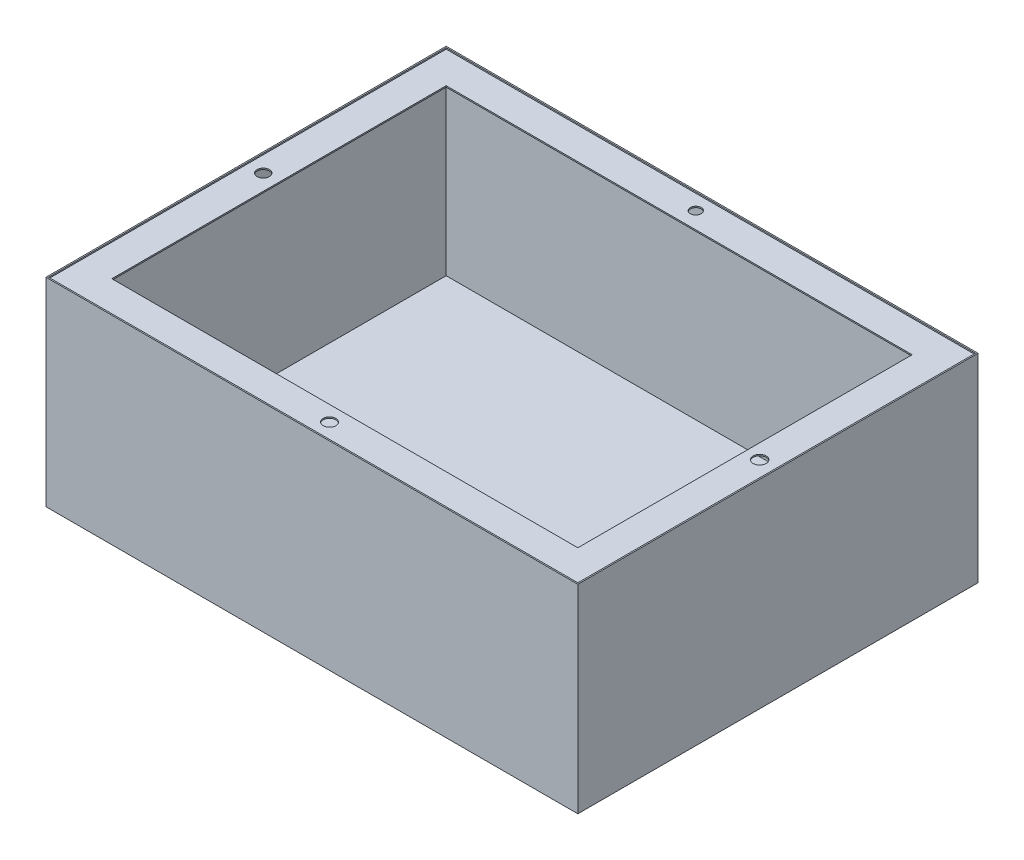
ISO-10303-21;
HEADER;
FILE_DESCRIPTION(('STEP AP214'),'2;1');
FILE_NAME('part.step','',(''),(''),'','','');
FILE_SCHEMA(('AUTOMOTIVE_DESIGN { 1 0 10303 214 1 1 1 1 }'));
ENDSEC;
DATA;
#1=APPLICATION_CONTEXT('core data for automotive mechanical design processes');
#2=APPLICATION_PROTOCOL_DEFINITION('international standard','automotive_design',2000,#1);
#3=PRODUCT_CONTEXT('',#1,'mechanical');
#4=PRODUCT('Part','Part','',(#3));
#5=PRODUCT_RELATED_PRODUCT_CATEGORY('part','',(#4));
#6=PRODUCT_DEFINITION_FORMATION('','',#4);
#7=PRODUCT_DEFINITION_CONTEXT('part definition',#1,'design');
#8=PRODUCT_DEFINITION('design','',#6,#7);
#9=PRODUCT_DEFINITION_SHAPE('','',#8);
#10=(LENGTH_UNIT() NAMED_UNIT(*) SI_UNIT(.MILLI.,.METRE.));
#11=(NAMED_UNIT(*) PLANE_ANGLE_UNIT() SI_UNIT($,.RADIAN.));
#12=(NAMED_UNIT(*) SI_UNIT($,.STERADIAN.) SOLID_ANGLE_UNIT());
#13=UNCERTAINTY_MEASURE_WITH_UNIT(LENGTH_MEASURE(1.E-05),#10,'distance_accuracy_value','');
#14=(GEOMETRIC_REPRESENTATION_CONTEXT(3) GLOBAL_UNCERTAINTY_ASSIGNED_CONTEXT((#13)) GLOBAL_UNIT_ASSIGNED_CONTEXT((#10,
#11,#12)) REPRESENTATION_CONTEXT('',''));
#15=CARTESIAN_POINT('',(0.,0.,0.));
#16=DIRECTION('',(0.,0.,1.));
#17=DIRECTION('',(1.,0.,0.));
#18=AXIS2_PLACEMENT_3D('',#15,#16,#17);
#19=CARTESIAN_POINT('',(204.2,153.4,-154.4));
#20=DIRECTION('',(1.,0.,0.));
#21=DIRECTION('',(0.,0.,-1.));
#22=AXIS2_PLACEMENT_3D('',#19,#20,#21);
#23=PLANE('',#22);
#24=DIRECTION('',(0.,0.,-1.));
#25=VECTOR('',#24,1.);
#26=CARTESIAN_POINT('',(204.2,152.4,-154.4));
#27=LINE('',#26,#25);
#28=CARTESIAN_POINT('',(204.2,152.4,153.4));
#29=VERTEX_POINT('',#28);
#30=CARTESIAN_POINT('',(204.2,152.4,-153.4));
#31=VERTEX_POINT('',#30);
#32=EDGE_CURVE('E217',#29,#31,#27,.T.);
#33=ORIENTED_EDGE('',*,*,#32,.F.);
#34=DIRECTION('',(0.,-1.,0.));
#35=VECTOR('',#34,1.);
#36=CARTESIAN_POINT('',(204.2,153.4,153.4));
#37=LINE('',#36,#35);
#38=CARTESIAN_POINT('',(204.2,153.4,153.4));
#39=VERTEX_POINT('',#38);
#40=EDGE_CURVE('E248',#39,#29,#37,.T.);
#41=ORIENTED_EDGE('',*,*,#40,.F.);
#42=DIRECTION('',(0.,0.,1.));
#43=VECTOR('',#42,1.);
#44=CARTESIAN_POINT('',(204.2,153.4,-154.4));
#45=LINE('',#44,#43);
#46=CARTESIAN_POINT('',(204.2,153.4,-153.4));
#47=VERTEX_POINT('',#46);
#48=EDGE_CURVE('E243',#47,#39,#45,.T.);
#49=ORIENTED_EDGE('',*,*,#48,.F.);
#50=DIRECTION('',(0.,1.,0.));
#51=VECTOR('',#50,1.);
#52=CARTESIAN_POINT('',(204.2,153.4,-153.4));
#53=LINE('',#52,#51);
#54=EDGE_CURVE('E238',#31,#47,#53,.T.);
#55=ORIENTED_EDGE('',*,*,#54,.F.);
#56=EDGE_LOOP('',(#33,#41,#49,#55));
#57=FACE_BOUND('',#56,.T.);
#58=ADVANCED_FACE('F64',(#57),#23,.F.);
#59=CARTESIAN_POINT('',(-205.2,153.4,153.4));
#60=DIRECTION('',(0.,0.,1.));
#61=DIRECTION('',(1.,0.,0.));
#62=AXIS2_PLACEMENT_3D('',#59,#60,#61);
#63=PLANE('',#62);
#64=ORIENTED_EDGE('',*,*,#40,.T.);
#65=DIRECTION('',(1.,0.,0.));
#66=VECTOR('',#65,1.);
#67=CARTESIAN_POINT('',(-205.2,152.4,153.4));
#68=LINE('',#67,#66);
#69=CARTESIAN_POINT('',(-204.2,152.4,153.4));
#70=VERTEX_POINT('',#69);
#71=EDGE_CURVE('E209',#70,#29,#68,.T.);
#72=ORIENTED_EDGE('',*,*,#71,.F.);
#73=DIRECTION('',(0.,1.,0.));
#74=VECTOR('',#73,1.);
#75=CARTESIAN_POINT('',(-204.2,153.4,153.4));
#76=LINE('',#75,#74);
#77=CARTESIAN_POINT('',(-204.2,153.4,153.4));
#78=VERTEX_POINT('',#77);
#79=EDGE_CURVE('E258',#70,#78,#76,.T.);
#80=ORIENTED_EDGE('',*,*,#79,.T.);
#81=DIRECTION('',(-1.,0.,0.));
#82=VECTOR('',#81,1.);
#83=CARTESIAN_POINT('',(-205.2,153.4,153.4));
#84=LINE('',#83,#82);
#85=EDGE_CURVE('E270',#39,#78,#84,.T.);
#86=ORIENTED_EDGE('',*,*,#85,.F.);
#87=EDGE_LOOP('',(#64,#72,#80,#86));
#88=FACE_BOUND('',#87,.T.);
#89=ADVANCED_FACE('F323',(#88),#63,.F.);
#90=CARTESIAN_POINT('',(-204.2,153.4,-154.4));
#91=DIRECTION('',(1.,0.,0.));
#92=DIRECTION('',(0.,0.,-1.));
#93=AXIS2_PLACEMENT_3D('',#90,#91,#92);
#94=PLANE('',#93);
#95=ORIENTED_EDGE('',*,*,#79,.F.);
#96=DIRECTION('',(0.,0.,-1.));
#97=VECTOR('',#96,1.);
#98=CARTESIAN_POINT('',(-204.2,152.4,-154.4));
#99=LINE('',#98,#97);
#100=CARTESIAN_POINT('',(-204.2,152.4,-153.4));
#101=VERTEX_POINT('',#100);
#102=EDGE_CURVE('E220',#70,#101,#99,.T.);
#103=ORIENTED_EDGE('',*,*,#102,.T.);
#104=DIRECTION('',(0.,-1.,0.));
#105=VECTOR('',#104,1.);
#106=CARTESIAN_POINT('',(-204.2,153.4,-153.4));
#107=LINE('',#106,#105);
#108=CARTESIAN_POINT('',(-204.2,153.4,-153.4));
#109=VERTEX_POINT('',#108);
#110=EDGE_CURVE('E235',#109,#101,#107,.T.);
#111=ORIENTED_EDGE('',*,*,#110,.F.);
#112=DIRECTION('',(0.,0.,1.));
#113=VECTOR('',#112,1.);
#114=CARTESIAN_POINT('',(-204.2,153.4,-154.4));
#115=LINE('',#114,#113);
#116=EDGE_CURVE('E252',#109,#78,#115,.T.);
#117=ORIENTED_EDGE('',*,*,#116,.T.);
#118=EDGE_LOOP('',(#95,#103,#111,#117));
#119=FACE_BOUND('',#118,.T.);
#120=ADVANCED_FACE('F329',(#119),#94,.T.);
#121=CARTESIAN_POINT('',(-204.2,153.4,-153.4));
#122=DIRECTION('',(0.,0.,-1.));
#123=DIRECTION('',(-1.,0.,0.));
#124=AXIS2_PLACEMENT_3D('',#121,#122,#123);
#125=PLANE('',#124);
#126=DIRECTION('',(-1.,0.,0.));
#127=VECTOR('',#126,1.);
#128=CARTESIAN_POINT('',(-204.2,152.4,-153.4));
#129=LINE('',#128,#127);
#130=EDGE_CURVE('E297',#31,#101,#129,.T.);
#131=ORIENTED_EDGE('',*,*,#130,.F.);
#132=ORIENTED_EDGE('',*,*,#54,.T.);
#133=DIRECTION('',(1.,0.,0.));
#134=VECTOR('',#133,1.);
#135=CARTESIAN_POINT('',(-204.2,153.4,-153.4));
#136=LINE('',#135,#134);
#137=EDGE_CURVE('E229',#109,#47,#136,.T.);
#138=ORIENTED_EDGE('',*,*,#137,.F.);
#139=ORIENTED_EDGE('',*,*,#110,.T.);
#140=EDGE_LOOP('',(#131,#132,#138,#139));
#141=FACE_BOUND('',#140,.T.);
#142=ADVANCED_FACE('F330',(#141),#125,.F.);
#143=CARTESIAN_POINT('',(0.,1.,0.));
#144=DIRECTION('',(0.,1.,0.));
#145=DIRECTION('',(0.,0.,1.));
#146=AXIS2_PLACEMENT_3D('',#143,#144,#145);
#147=PLANE('',#146);
#148=DIRECTION('',(-1.,0.,0.));
#149=VECTOR('',#148,1.);
#150=CARTESIAN_POINT('',(-205.2,1.,153.4));
#151=LINE('',#150,#149);
#152=CARTESIAN_POINT('',(204.2,1.,153.4));
#153=VERTEX_POINT('',#152);
#154=CARTESIAN_POINT('',(-204.2,1.,153.4));
#155=VERTEX_POINT('',#154);
#156=EDGE_CURVE('E264',#153,#155,#151,.T.);
#157=ORIENTED_EDGE('',*,*,#156,.F.);
#158=DIRECTION('',(0.,0.,1.));
#159=VECTOR('',#158,1.);
#160=CARTESIAN_POINT('',(204.2,1.,-154.4));
#161=LINE('',#160,#159);
#162=CARTESIAN_POINT('',(204.2,1.,-153.4));
#163=VERTEX_POINT('',#162);
#164=EDGE_CURVE('E242',#163,#153,#161,.T.);
#165=ORIENTED_EDGE('',*,*,#164,.F.);
#166=DIRECTION('',(1.,0.,0.));
#167=VECTOR('',#166,1.);
#168=CARTESIAN_POINT('',(-204.2,1.,-153.4));
#169=LINE('',#168,#167);
#170=CARTESIAN_POINT('',(-204.2,1.,-153.4));
#171=VERTEX_POINT('',#170);
#172=EDGE_CURVE('E228',#171,#163,#169,.T.);
#173=ORIENTED_EDGE('',*,*,#172,.F.);
#174=DIRECTION('',(0.,0.,1.));
#175=VECTOR('',#174,1.);
#176=CARTESIAN_POINT('',(-204.2,1.,-154.4));
#177=LINE('',#176,#175);
#178=EDGE_CURVE('E251',#171,#155,#177,.T.);
#179=ORIENTED_EDGE('',*,*,#178,.T.);
#180=EDGE_LOOP('',(#157,#165,#173,#179));
#181=FACE_BOUND('',#180,.T.);
#182=ADVANCED_FACE('F314',(#181),#147,.T.);
#183=DIRECTION('',(1.,0.,0.));
#184=VECTOR('',#183,1.);
#185=CARTESIAN_POINT('',(-205.2,151.4,153.4));
#186=LINE('',#185,#184);
#187=CARTESIAN_POINT('',(-204.2,151.4,153.4));
#188=VERTEX_POINT('',#187);
#189=CARTESIAN_POINT('',(204.2,151.4,153.4));
#190=VERTEX_POINT('',#189);
#191=EDGE_CURVE('E212',#188,#190,#186,.T.);
#192=ORIENTED_EDGE('',*,*,#191,.T.);
#193=EDGE_CURVE('E245',#190,#153,#37,.T.);
#194=ORIENTED_EDGE('',*,*,#193,.T.);
#195=ORIENTED_EDGE('',*,*,#156,.T.);
#196=EDGE_CURVE('E261',#155,#188,#76,.T.);
#197=ORIENTED_EDGE('',*,*,#196,.T.);
#198=EDGE_LOOP('',(#192,#194,#195,#197));
#199=FACE_BOUND('',#198,.T.);
#200=ADVANCED_FACE('F320',(#199),#63,.F.);
#201=DIRECTION('',(0.,0.,-1.));
#202=VECTOR('',#201,1.);
#203=CARTESIAN_POINT('',(-204.2,151.4,-154.4));
#204=LINE('',#203,#202);
#205=CARTESIAN_POINT('',(-204.2,151.4,-153.4));
#206=VERTEX_POINT('',#205);
#207=EDGE_CURVE('E225',#188,#206,#204,.T.);
#208=ORIENTED_EDGE('',*,*,#207,.F.);
#209=ORIENTED_EDGE('',*,*,#196,.F.);
#210=ORIENTED_EDGE('',*,*,#178,.F.);
#211=EDGE_CURVE('E232',#206,#171,#107,.T.);
#212=ORIENTED_EDGE('',*,*,#211,.F.);
#213=EDGE_LOOP('',(#208,#209,#210,#212));
#214=FACE_BOUND('',#213,.T.);
#215=ADVANCED_FACE('F311',(#214),#94,.T.);
#216=CARTESIAN_POINT('',(205.2,1.,-154.4));
#217=DIRECTION('',(-1.,0.,0.));
#218=DIRECTION('',(0.,0.,1.));
#219=AXIS2_PLACEMENT_3D('',#216,#217,#218);
#220=PLANE('',#219);
#221=DIRECTION('',(0.,0.,-1.));
#222=VECTOR('',#221,1.);
#223=CARTESIAN_POINT('',(205.2,0.,-154.4));
#224=LINE('',#223,#222);
#225=CARTESIAN_POINT('',(205.2,0.,154.4));
#226=VERTEX_POINT('',#225);
#227=CARTESIAN_POINT('',(205.2,0.,-154.4));
#228=VERTEX_POINT('',#227);
#229=EDGE_CURVE('E276',#226,#228,#224,.T.);
#230=ORIENTED_EDGE('',*,*,#229,.T.);
#231=DIRECTION('',(0.,-1.,0.));
#232=VECTOR('',#231,1.);
#233=CARTESIAN_POINT('',(205.2,1.,-154.4));
#234=LINE('',#233,#232);
#235=CARTESIAN_POINT('',(205.2,153.4,-154.4));
#236=VERTEX_POINT('',#235);
#237=EDGE_CURVE('E295',#236,#228,#234,.T.);
#238=ORIENTED_EDGE('',*,*,#237,.F.);
#239=DIRECTION('',(0.,0.,-1.));
#240=VECTOR('',#239,1.);
#241=CARTESIAN_POINT('',(205.2,153.4,154.4));
#242=LINE('',#241,#240);
#243=CARTESIAN_POINT('',(205.2,153.4,154.4));
#244=VERTEX_POINT('',#243);
#245=EDGE_CURVE('E267',#244,#236,#242,.T.);
#246=ORIENTED_EDGE('',*,*,#245,.F.);
#247=DIRECTION('',(0.,-1.,0.));
#248=VECTOR('',#247,1.);
#249=CARTESIAN_POINT('',(205.2,1.,154.4));
#250=LINE('',#249,#248);
#251=EDGE_CURVE('E289',#244,#226,#250,.T.);
#252=ORIENTED_EDGE('',*,*,#251,.T.);
#253=EDGE_LOOP('',(#230,#238,#246,#252));
#254=FACE_BOUND('',#253,.T.);
#255=ADVANCED_FACE('F66',(#254),#220,.F.);
#256=CARTESIAN_POINT('',(-205.2,1.,-154.4));
#257=DIRECTION('',(0.,0.,1.));
#258=DIRECTION('',(1.,0.,0.));
#259=AXIS2_PLACEMENT_3D('',#256,#257,#258);
#260=PLANE('',#259);
#261=ORIENTED_EDGE('',*,*,#237,.T.);
#262=DIRECTION('',(-1.,0.,0.));
#263=VECTOR('',#262,1.);
#264=CARTESIAN_POINT('',(-205.2,0.,-154.4));
#265=LINE('',#264,#263);
#266=CARTESIAN_POINT('',(-205.2,0.,-154.4));
#267=VERTEX_POINT('',#266);
#268=EDGE_CURVE('E280',#228,#267,#265,.T.);
#269=ORIENTED_EDGE('',*,*,#268,.T.);
#270=DIRECTION('',(0.,-1.,0.));
#271=VECTOR('',#270,1.);
#272=CARTESIAN_POINT('',(-205.2,1.,-154.4));
#273=LINE('',#272,#271);
#274=CARTESIAN_POINT('',(-205.2,153.4,-154.4));
#275=VERTEX_POINT('',#274);
#276=EDGE_CURVE('E293',#275,#267,#273,.T.);
#277=ORIENTED_EDGE('',*,*,#276,.F.);
#278=DIRECTION('',(1.,0.,0.));
#279=VECTOR('',#278,1.);
#280=CARTESIAN_POINT('',(-205.2,153.4,-154.4));
#281=LINE('',#280,#279);
#282=EDGE_CURVE('E255',#275,#236,#281,.T.);
#283=ORIENTED_EDGE('',*,*,#282,.T.);
#284=EDGE_LOOP('',(#261,#269,#277,#283));
#285=FACE_BOUND('',#284,.T.);
#286=ADVANCED_FACE('F365',(#285),#260,.F.);
#287=CARTESIAN_POINT('',(-205.2,1.,-154.4));
#288=DIRECTION('',(1.,0.,0.));
#289=DIRECTION('',(0.,0.,-1.));
#290=AXIS2_PLACEMENT_3D('',#287,#288,#289);
#291=PLANE('',#290);
#292=DIRECTION('',(0.,0.,1.));
#293=VECTOR('',#292,1.);
#294=CARTESIAN_POINT('',(-205.2,0.,-154.4));
#295=LINE('',#294,#293);
#296=CARTESIAN_POINT('',(-205.2,0.,154.4));
#297=VERTEX_POINT('',#296);
#298=EDGE_CURVE('E283',#267,#297,#295,.T.);
#299=ORIENTED_EDGE('',*,*,#298,.T.);
#300=DIRECTION('',(0.,-1.,0.));
#301=VECTOR('',#300,1.);
#302=CARTESIAN_POINT('',(-205.2,1.,154.4));
#303=LINE('',#302,#301);
#304=CARTESIAN_POINT('',(-205.2,153.4,154.4));
#305=VERTEX_POINT('',#304);
#306=EDGE_CURVE('E291',#305,#297,#303,.T.);
#307=ORIENTED_EDGE('',*,*,#306,.F.);
#308=DIRECTION('',(0.,0.,1.));
#309=VECTOR('',#308,1.);
#310=CARTESIAN_POINT('',(-205.2,153.4,153.4));
#311=LINE('',#310,#309);
#312=EDGE_CURVE('E273',#275,#305,#311,.T.);
#313=ORIENTED_EDGE('',*,*,#312,.F.);
#314=ORIENTED_EDGE('',*,*,#276,.T.);
#315=EDGE_LOOP('',(#299,#307,#313,#314));
#316=FACE_BOUND('',#315,.T.);
#317=ADVANCED_FACE('F370',(#316),#291,.F.);
#318=CARTESIAN_POINT('',(-205.2,1.,154.4));
#319=DIRECTION('',(0.,0.,-1.));
#320=DIRECTION('',(-1.,0.,0.));
#321=AXIS2_PLACEMENT_3D('',#318,#319,#320);
#322=PLANE('',#321);
#323=DIRECTION('',(1.,0.,0.));
#324=VECTOR('',#323,1.);
#325=CARTESIAN_POINT('',(-205.2,0.,154.4));
#326=LINE('',#325,#324);
#327=EDGE_CURVE('E286',#297,#226,#326,.T.);
#328=ORIENTED_EDGE('',*,*,#327,.T.);
#329=ORIENTED_EDGE('',*,*,#251,.F.);
#330=DIRECTION('',(1.,0.,0.));
#331=VECTOR('',#330,1.);
#332=CARTESIAN_POINT('',(-205.2,153.4,154.4));
#333=LINE('',#332,#331);
#334=EDGE_CURVE('E265',#305,#244,#333,.T.);
#335=ORIENTED_EDGE('',*,*,#334,.F.);
#336=ORIENTED_EDGE('',*,*,#306,.T.);
#337=EDGE_LOOP('',(#328,#329,#335,#336));
#338=FACE_BOUND('',#337,.T.);
#339=ADVANCED_FACE('F353',(#338),#322,.F.);
#340=CARTESIAN_POINT('',(0.,0.,0.));
#341=DIRECTION('',(0.,1.,0.));
#342=DIRECTION('',(0.,0.,1.));
#343=AXIS2_PLACEMENT_3D('',#340,#341,#342);
#344=PLANE('',#343);
#345=ORIENTED_EDGE('',*,*,#229,.F.);
#346=ORIENTED_EDGE('',*,*,#327,.F.);
#347=ORIENTED_EDGE('',*,*,#298,.F.);
#348=ORIENTED_EDGE('',*,*,#268,.F.);
#349=EDGE_LOOP('',(#345,#346,#347,#348));
#350=FACE_BOUND('',#349,.T.);
#351=ADVANCED_FACE('F348',(#350),#344,.F.);
#352=CARTESIAN_POINT('',(0.,153.4,0.));
#353=DIRECTION('',(0.,1.,0.));
#354=DIRECTION('',(0.,0.,1.));
#355=AXIS2_PLACEMENT_3D('',#352,#353,#354);
#356=PLANE('',#355);
#357=ORIENTED_EDGE('',*,*,#48,.T.);
#358=ORIENTED_EDGE('',*,*,#85,.T.);
#359=ORIENTED_EDGE('',*,*,#116,.F.);
#360=ORIENTED_EDGE('',*,*,#137,.T.);
#361=EDGE_LOOP('',(#357,#358,#359,#360));
#362=FACE_BOUND('',#361,.T.);
#363=ORIENTED_EDGE('',*,*,#245,.T.);
#364=ORIENTED_EDGE('',*,*,#282,.F.);
#365=ORIENTED_EDGE('',*,*,#312,.T.);
#366=ORIENTED_EDGE('',*,*,#334,.T.);
#367=EDGE_LOOP('',(#363,#364,#365,#366));
#368=FACE_BOUND('',#367,.T.);
#369=ADVANCED_FACE('F342',(#362,#368),#356,.T.);
#370=ORIENTED_EDGE('',*,*,#193,.F.);
#371=DIRECTION('',(0.,0.,-1.));
#372=VECTOR('',#371,1.);
#373=CARTESIAN_POINT('',(204.2,151.4,-154.4));
#374=LINE('',#373,#372);
#375=CARTESIAN_POINT('',(204.2,151.4,-153.4));
#376=VERTEX_POINT('',#375);
#377=EDGE_CURVE('E223',#190,#376,#374,.T.);
#378=ORIENTED_EDGE('',*,*,#377,.T.);
#379=EDGE_CURVE('E239',#163,#376,#53,.T.);
#380=ORIENTED_EDGE('',*,*,#379,.F.);
#381=ORIENTED_EDGE('',*,*,#164,.T.);
#382=EDGE_LOOP('',(#370,#378,#380,#381));
#383=FACE_BOUND('',#382,.T.);
#384=ADVANCED_FACE('F318',(#383),#23,.F.);
#385=ORIENTED_EDGE('',*,*,#379,.T.);
#386=DIRECTION('',(-1.,0.,0.));
#387=VECTOR('',#386,1.);
#388=CARTESIAN_POINT('',(-204.2,151.4,-153.4));
#389=LINE('',#388,#387);
#390=EDGE_CURVE('E299',#376,#206,#389,.T.);
#391=ORIENTED_EDGE('',*,*,#390,.T.);
#392=ORIENTED_EDGE('',*,*,#211,.T.);
#393=ORIENTED_EDGE('',*,*,#172,.T.);
#394=EDGE_LOOP('',(#385,#391,#392,#393));
#395=FACE_BOUND('',#394,.T.);
#396=ADVANCED_FACE('F302',(#395),#125,.F.);
#397=CARTESIAN_POINT('',(0.,0.,-129.));
#398=DIRECTION('',(0.,0.,1.));
#399=DIRECTION('',(1.,0.,0.));
#400=AXIS2_PLACEMENT_3D('',#397,#398,#399);
#401=PLANE('',#400);
#402=DIRECTION('',(0.,-1.,0.));
#403=VECTOR('',#402,1.);
#404=CARTESIAN_POINT('',(179.8,0.,-129.));
#405=LINE('',#404,#403);
#406=CARTESIAN_POINT('',(179.8,152.4,-129.));
#407=VERTEX_POINT('',#406);
#408=CARTESIAN_POINT('',(179.8,151.4,-129.));
#409=VERTEX_POINT('',#408);
#410=EDGE_CURVE('E83',#407,#409,#405,.T.);
#411=ORIENTED_EDGE('',*,*,#410,.F.);
#412=DIRECTION('',(-1.,0.,0.));
#413=VECTOR('',#412,1.);
#414=CARTESIAN_POINT('',(205.2,152.4,-129.));
#415=LINE('',#414,#413);
#416=CARTESIAN_POINT('',(-179.8,152.4,-129.));
#417=VERTEX_POINT('',#416);
#418=EDGE_CURVE('E194',#407,#417,#415,.T.);
#419=ORIENTED_EDGE('',*,*,#418,.T.);
#420=DIRECTION('',(0.,1.,0.));
#421=VECTOR('',#420,1.);
#422=CARTESIAN_POINT('',(-179.8,0.,-129.));
#423=LINE('',#422,#421);
#424=CARTESIAN_POINT('',(-179.8,151.4,-129.));
#425=VERTEX_POINT('',#424);
#426=EDGE_CURVE('E206',#425,#417,#423,.T.);
#427=ORIENTED_EDGE('',*,*,#426,.F.);
#428=DIRECTION('',(-1.,0.,0.));
#429=VECTOR('',#428,1.);
#430=CARTESIAN_POINT('',(205.2,151.4,-129.));
#431=LINE('',#430,#429);
#432=EDGE_CURVE('E79',#409,#425,#431,.T.);
#433=ORIENTED_EDGE('',*,*,#432,.F.);
#434=EDGE_LOOP('',(#411,#419,#427,#433));
#435=FACE_BOUND('',#434,.T.);
#436=ADVANCED_FACE('F347',(#435),#401,.T.);
#437=CARTESIAN_POINT('',(205.2,151.4,-129.));
#438=DIRECTION('',(0.,-1.,0.));
#439=DIRECTION('',(0.,0.,-1.));
#440=AXIS2_PLACEMENT_3D('',#437,#438,#439);
#441=PLANE('',#440);
#442=CARTESIAN_POINT('',(191.104510434709,151.4,0.));
#443=DIRECTION('',(0.,-1.,0.));
#444=DIRECTION('',(0.,0.,-1.));
#445=AXIS2_PLACEMENT_3D('',#442,#443,#444);
#446=CIRCLE('',#445,5.05609590249361);
#447=CARTESIAN_POINT('',(191.104510434709,151.4,-5.05609590249361));
#448=VERTEX_POINT('',#447);
#449=EDGE_CURVE('E197',#448,#448,#446,.T.);
#450=ORIENTED_EDGE('',*,*,#449,.F.);
#451=EDGE_LOOP('',(#450));
#452=FACE_BOUND('',#451,.T.);
#453=CARTESIAN_POINT('',(-191.953029846043,151.4,0.));
#454=DIRECTION('',(0.,-1.,0.));
#455=DIRECTION('',(0.,0.,-1.));
#456=AXIS2_PLACEMENT_3D('',#453,#454,#455);
#457=CIRCLE('',#456,4.7370564135253);
#458=CARTESIAN_POINT('',(-191.953029846043,151.4,-4.7370564135253));
#459=VERTEX_POINT('',#458);
#460=EDGE_CURVE('E662',#459,#459,#457,.T.);
#461=ORIENTED_EDGE('',*,*,#460,.F.);
#462=EDGE_LOOP('',(#461));
#463=FACE_BOUND('',#462,.T.);
#464=CARTESIAN_POINT('',(0.,151.4,-141.834718346005));
#465=DIRECTION('',(0.,-1.,0.));
#466=DIRECTION('',(0.,0.,-1.));
#467=AXIS2_PLACEMENT_3D('',#464,#465,#466);
#468=CIRCLE('',#467,4.19433413739189);
#469=CARTESIAN_POINT('',(0.,151.4,-146.029052483397));
#470=VERTEX_POINT('',#469);
#471=EDGE_CURVE('E649',#470,#470,#468,.T.);
#472=ORIENTED_EDGE('',*,*,#471,.F.);
#473=EDGE_LOOP('',(#472));
#474=FACE_BOUND('',#473,.T.);
#475=CARTESIAN_POINT('',(0.,151.4,140.765526806026));
#476=DIRECTION('',(0.,-1.,0.));
#477=DIRECTION('',(0.,0.,-1.));
#478=AXIS2_PLACEMENT_3D('',#475,#476,#477);
#479=CIRCLE('',#478,4.88730836621316);
#480=CARTESIAN_POINT('',(0.,151.4,135.878218439813));
#481=VERTEX_POINT('',#480);
#482=EDGE_CURVE('E645',#481,#481,#479,.T.);
#483=ORIENTED_EDGE('',*,*,#482,.F.);
#484=EDGE_LOOP('',(#483));
#485=FACE_BOUND('',#484,.T.);
#486=DIRECTION('',(0.,0.,-1.));
#487=VECTOR('',#486,1.);
#488=CARTESIAN_POINT('',(179.8,151.4,154.4));
#489=LINE('',#488,#487);
#490=CARTESIAN_POINT('',(179.8,151.4,129.));
#491=VERTEX_POINT('',#490);
#492=EDGE_CURVE('E191',#491,#409,#489,.T.);
#493=ORIENTED_EDGE('',*,*,#492,.T.);
#494=ORIENTED_EDGE('',*,*,#432,.T.);
#495=DIRECTION('',(0.,0.,1.));
#496=VECTOR('',#495,1.);
#497=CARTESIAN_POINT('',(-179.8,151.4,-154.4));
#498=LINE('',#497,#496);
#499=CARTESIAN_POINT('',(-179.8,151.4,129.));
#500=VERTEX_POINT('',#499);
#501=EDGE_CURVE('E182',#425,#500,#498,.T.);
#502=ORIENTED_EDGE('',*,*,#501,.T.);
#503=DIRECTION('',(1.,0.,0.));
#504=VECTOR('',#503,1.);
#505=CARTESIAN_POINT('',(-205.2,151.4,129.));
#506=LINE('',#505,#504);
#507=EDGE_CURVE('E183',#500,#491,#506,.T.);
#508=ORIENTED_EDGE('',*,*,#507,.T.);
#509=EDGE_LOOP('',(#493,#494,#502,#508));
#510=FACE_BOUND('',#509,.T.);
#511=ORIENTED_EDGE('',*,*,#377,.F.);
#512=ORIENTED_EDGE('',*,*,#191,.F.);
#513=ORIENTED_EDGE('',*,*,#207,.T.);
#514=ORIENTED_EDGE('',*,*,#390,.F.);
#515=EDGE_LOOP('',(#511,#512,#513,#514));
#516=FACE_BOUND('',#515,.T.);
#517=ADVANCED_FACE('F307',(#452,#463,#474,#485,#510,#516),#441,.T.);
#518=CARTESIAN_POINT('',(205.2,152.4,-129.));
#519=DIRECTION('',(0.,-1.,0.));
#520=DIRECTION('',(0.,0.,-1.));
#521=AXIS2_PLACEMENT_3D('',#518,#519,#520);
#522=PLANE('',#521);
#523=CARTESIAN_POINT('',(191.104510434709,152.4,0.));
#524=DIRECTION('',(0.,1.,0.));
#525=DIRECTION('',(0.,0.,1.));
#526=AXIS2_PLACEMENT_3D('',#523,#524,#525);
#527=CIRCLE('',#526,5.05609590249361);
#528=CARTESIAN_POINT('',(191.104510434709,152.4,5.05609590249361));
#529=VERTEX_POINT('',#528);
#530=EDGE_CURVE('E644',#529,#529,#527,.T.);
#531=ORIENTED_EDGE('',*,*,#530,.F.);
#532=EDGE_LOOP('',(#531));
#533=FACE_BOUND('',#532,.T.);
#534=CARTESIAN_POINT('',(-191.953029846043,152.4,0.));
#535=DIRECTION('',(0.,1.,0.));
#536=DIRECTION('',(0.,0.,1.));
#537=AXIS2_PLACEMENT_3D('',#534,#535,#536);
#538=CIRCLE('',#537,4.7370564135253);
#539=CARTESIAN_POINT('',(-191.953029846043,152.4,4.7370564135253));
#540=VERTEX_POINT('',#539);
#541=EDGE_CURVE('E646',#540,#540,#538,.T.);
#542=ORIENTED_EDGE('',*,*,#541,.F.);
#543=EDGE_LOOP('',(#542));
#544=FACE_BOUND('',#543,.T.);
#545=CARTESIAN_POINT('',(0.,152.4,-141.834718346005));
#546=DIRECTION('',(0.,1.,0.));
#547=DIRECTION('',(0.,0.,1.));
#548=AXIS2_PLACEMENT_3D('',#545,#546,#547);
#549=CIRCLE('',#548,4.19433413739189);
#550=CARTESIAN_POINT('',(0.,152.4,-137.640384208613));
#551=VERTEX_POINT('',#550);
#552=EDGE_CURVE('E652',#551,#551,#549,.T.);
#553=ORIENTED_EDGE('',*,*,#552,.F.);
#554=EDGE_LOOP('',(#553));
#555=FACE_BOUND('',#554,.T.);
#556=CARTESIAN_POINT('',(0.,152.4,140.765526806026));
#557=DIRECTION('',(0.,1.,0.));
#558=DIRECTION('',(0.,0.,1.));
#559=AXIS2_PLACEMENT_3D('',#556,#557,#558);
#560=CIRCLE('',#559,4.88730836621316);
#561=CARTESIAN_POINT('',(0.,152.4,145.65283517224));
#562=VERTEX_POINT('',#561);
#563=EDGE_CURVE('E657',#562,#562,#560,.T.);
#564=ORIENTED_EDGE('',*,*,#563,.F.);
#565=EDGE_LOOP('',(#564));
#566=FACE_BOUND('',#565,.T.);
#567=ORIENTED_EDGE('',*,*,#418,.F.);
#568=DIRECTION('',(0.,0.,-1.));
#569=VECTOR('',#568,1.);
#570=CARTESIAN_POINT('',(179.8,152.4,154.4));
#571=LINE('',#570,#569);
#572=CARTESIAN_POINT('',(179.8,152.4,129.));
#573=VERTEX_POINT('',#572);
#574=EDGE_CURVE('E189',#573,#407,#571,.T.);
#575=ORIENTED_EDGE('',*,*,#574,.F.);
#576=DIRECTION('',(1.,0.,0.));
#577=VECTOR('',#576,1.);
#578=CARTESIAN_POINT('',(-205.2,152.4,129.));
#579=LINE('',#578,#577);
#580=CARTESIAN_POINT('',(-179.8,152.4,129.));
#581=VERTEX_POINT('',#580);
#582=EDGE_CURVE('E175',#581,#573,#579,.T.);
#583=ORIENTED_EDGE('',*,*,#582,.F.);
#584=DIRECTION('',(0.,0.,1.));
#585=VECTOR('',#584,1.);
#586=CARTESIAN_POINT('',(-179.8,152.4,-154.4));
#587=LINE('',#586,#585);
#588=EDGE_CURVE('E204',#417,#581,#587,.T.);
#589=ORIENTED_EDGE('',*,*,#588,.F.);
#590=EDGE_LOOP('',(#567,#575,#583,#589));
#591=FACE_BOUND('',#590,.T.);
#592=ORIENTED_EDGE('',*,*,#71,.T.);
#593=ORIENTED_EDGE('',*,*,#32,.T.);
#594=ORIENTED_EDGE('',*,*,#130,.T.);
#595=ORIENTED_EDGE('',*,*,#102,.F.);
#596=EDGE_LOOP('',(#592,#593,#594,#595));
#597=FACE_BOUND('',#596,.T.);
#598=ADVANCED_FACE('F192',(#533,#544,#555,#566,#591,#597),#522,.F.);
#599=CARTESIAN_POINT('',(-179.8,0.,0.));
#600=DIRECTION('',(1.,0.,0.));
#601=DIRECTION('',(0.,0.,-1.));
#602=AXIS2_PLACEMENT_3D('',#599,#600,#601);
#603=PLANE('',#602);
#604=DIRECTION('',(0.,1.,0.));
#605=VECTOR('',#604,1.);
#606=CARTESIAN_POINT('',(-179.8,0.,129.));
#607=LINE('',#606,#605);
#608=EDGE_CURVE('E72',#500,#581,#607,.T.);
#609=ORIENTED_EDGE('',*,*,#608,.F.);
#610=ORIENTED_EDGE('',*,*,#501,.F.);
#611=ORIENTED_EDGE('',*,*,#426,.T.);
#612=ORIENTED_EDGE('',*,*,#588,.T.);
#613=EDGE_LOOP('',(#609,#610,#611,#612));
#614=FACE_BOUND('',#613,.T.);
#615=ADVANCED_FACE('F440',(#614),#603,.T.);
#616=CARTESIAN_POINT('',(0.,0.,129.));
#617=DIRECTION('',(0.,0.,-1.));
#618=DIRECTION('',(-1.,0.,0.));
#619=AXIS2_PLACEMENT_3D('',#616,#617,#618);
#620=PLANE('',#619);
#621=DIRECTION('',(0.,1.,0.));
#622=VECTOR('',#621,1.);
#623=CARTESIAN_POINT('',(179.8,0.,129.));
#624=LINE('',#623,#622);
#625=EDGE_CURVE('E12',#491,#573,#624,.T.);
#626=ORIENTED_EDGE('',*,*,#625,.F.);
#627=ORIENTED_EDGE('',*,*,#507,.F.);
#628=ORIENTED_EDGE('',*,*,#608,.T.);
#629=ORIENTED_EDGE('',*,*,#582,.T.);
#630=EDGE_LOOP('',(#626,#627,#628,#629));
#631=FACE_BOUND('',#630,.T.);
#632=ADVANCED_FACE('F176',(#631),#620,.T.);
#633=CARTESIAN_POINT('',(179.8,0.,0.));
#634=DIRECTION('',(-1.,0.,0.));
#635=DIRECTION('',(0.,0.,1.));
#636=AXIS2_PLACEMENT_3D('',#633,#634,#635);
#637=PLANE('',#636);
#638=ORIENTED_EDGE('',*,*,#574,.T.);
#639=ORIENTED_EDGE('',*,*,#410,.T.);
#640=ORIENTED_EDGE('',*,*,#492,.F.);
#641=ORIENTED_EDGE('',*,*,#625,.T.);
#642=EDGE_LOOP('',(#638,#639,#640,#641));
#643=FACE_BOUND('',#642,.T.);
#644=ADVANCED_FACE('F188',(#643),#637,.T.);
#645=CARTESIAN_POINT('',(0.,142.4,140.765526806026));
#646=DIRECTION('',(0.,1.,0.));
#647=DIRECTION('',(0.,0.,1.));
#648=AXIS2_PLACEMENT_3D('',#645,#646,#647);
#649=CYLINDRICAL_SURFACE('',#648,4.88730836621316);
#650=ORIENTED_EDGE('',*,*,#482,.T.);
#651=EDGE_LOOP('',(#650));
#652=FACE_BOUND('',#651,.T.);
#653=ORIENTED_EDGE('',*,*,#563,.T.);
#654=EDGE_LOOP('',(#653));
#655=FACE_BOUND('',#654,.T.);
#656=ADVANCED_FACE('F588',(#652,#655),#649,.F.);
#657=CARTESIAN_POINT('',(0.,142.4,-141.834718346005));
#658=DIRECTION('',(0.,1.,0.));
#659=DIRECTION('',(0.,0.,1.));
#660=AXIS2_PLACEMENT_3D('',#657,#658,#659);
#661=CYLINDRICAL_SURFACE('',#660,4.19433413739189);
#662=ORIENTED_EDGE('',*,*,#471,.T.);
#663=EDGE_LOOP('',(#662));
#664=FACE_BOUND('',#663,.T.);
#665=ORIENTED_EDGE('',*,*,#552,.T.);
#666=EDGE_LOOP('',(#665));
#667=FACE_BOUND('',#666,.T.);
#668=ADVANCED_FACE('F597',(#664,#667),#661,.F.);
#669=CARTESIAN_POINT('',(-191.953029846043,142.4,0.));
#670=DIRECTION('',(0.,1.,0.));
#671=DIRECTION('',(0.,0.,1.));
#672=AXIS2_PLACEMENT_3D('',#669,#670,#671);
#673=CYLINDRICAL_SURFACE('',#672,4.7370564135253);
#674=ORIENTED_EDGE('',*,*,#460,.T.);
#675=EDGE_LOOP('',(#674));
#676=FACE_BOUND('',#675,.T.);
#677=ORIENTED_EDGE('',*,*,#541,.T.);
#678=EDGE_LOOP('',(#677));
#679=FACE_BOUND('',#678,.T.);
#680=ADVANCED_FACE('F608',(#676,#679),#673,.F.);
#681=CARTESIAN_POINT('',(191.104510434709,142.4,0.));
#682=DIRECTION('',(0.,1.,0.));
#683=DIRECTION('',(0.,0.,1.));
#684=AXIS2_PLACEMENT_3D('',#681,#682,#683);
#685=CYLINDRICAL_SURFACE('',#684,5.05609590249361);
#686=ORIENTED_EDGE('',*,*,#449,.T.);
#687=EDGE_LOOP('',(#686));
#688=FACE_BOUND('',#687,.T.);
#689=ORIENTED_EDGE('',*,*,#530,.T.);
#690=EDGE_LOOP('',(#689));
#691=FACE_BOUND('',#690,.T.);
#692=ADVANCED_FACE('F619',(#688,#691),#685,.F.);
#693=CLOSED_SHELL('',(#58,#89,#120,#142,#182,#200,#215,#255,#286,#317,#339,#351,#369,#384,#396,
#436,#517,#598,#615,#632,#644,#656,#668,#680,#692));
#694=MANIFOLD_SOLID_BREP('B2',#693);
#695=ADVANCED_BREP_SHAPE_REPRESENTATION('',(#18,#694),#14);
#696=SHAPE_DEFINITION_REPRESENTATION(#9,#695);
ENDSEC;
END-ISO-10303-21;
